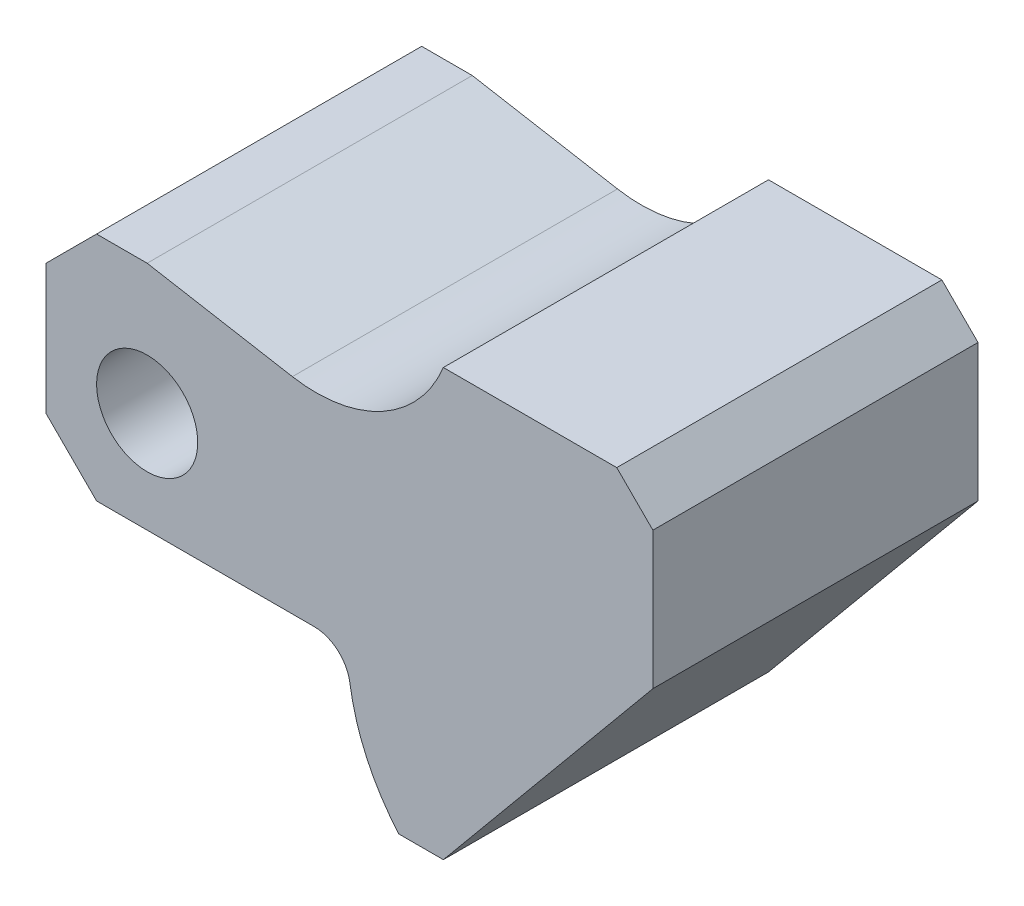
ISO-10303-21;
HEADER;
FILE_DESCRIPTION(('STEP AP214'),'2;1');
FILE_NAME('part.step','',(''),(''),'','','');
FILE_SCHEMA(('AUTOMOTIVE_DESIGN { 1 0 10303 214 1 1 1 1 }'));
ENDSEC;
DATA;
#1=APPLICATION_CONTEXT('core data for automotive mechanical design processes');
#2=APPLICATION_PROTOCOL_DEFINITION('international standard','automotive_design',2000,#1);
#3=PRODUCT_CONTEXT('',#1,'mechanical');
#4=PRODUCT('Part','Part','',(#3));
#5=PRODUCT_RELATED_PRODUCT_CATEGORY('part','',(#4));
#6=PRODUCT_DEFINITION_FORMATION('','',#4);
#7=PRODUCT_DEFINITION_CONTEXT('part definition',#1,'design');
#8=PRODUCT_DEFINITION('design','',#6,#7);
#9=PRODUCT_DEFINITION_SHAPE('','',#8);
#10=(LENGTH_UNIT() NAMED_UNIT(*) SI_UNIT(.MILLI.,.METRE.));
#11=(NAMED_UNIT(*) PLANE_ANGLE_UNIT() SI_UNIT($,.RADIAN.));
#12=(NAMED_UNIT(*) SI_UNIT($,.STERADIAN.) SOLID_ANGLE_UNIT());
#13=UNCERTAINTY_MEASURE_WITH_UNIT(LENGTH_MEASURE(1.E-05),#10,'distance_accuracy_value','');
#14=(GEOMETRIC_REPRESENTATION_CONTEXT(3) GLOBAL_UNCERTAINTY_ASSIGNED_CONTEXT((#13)) GLOBAL_UNIT_ASSIGNED_CONTEXT((#10,
#11,#12)) REPRESENTATION_CONTEXT('',''));
#15=CARTESIAN_POINT('',(0.,0.,0.));
#16=DIRECTION('',(0.,0.,1.));
#17=DIRECTION('',(1.,0.,0.));
#18=AXIS2_PLACEMENT_3D('',#15,#16,#17);
#19=CARTESIAN_POINT('',(56.7428571428571,-14.,45.));
#20=DIRECTION('',(0.,0.,-1.));
#21=DIRECTION('',(-1.,0.,0.));
#22=AXIS2_PLACEMENT_3D('',#19,#20,#21);
#23=PLANE('',#22);
#24=DIRECTION('',(0.,1.,0.));
#25=VECTOR('',#24,1.);
#26=CARTESIAN_POINT('',(70.,26.,45.));
#27=LINE('',#26,#25);
#28=CARTESIAN_POINT('',(70.,2.00000000000001,45.));
#29=VERTEX_POINT('',#28);
#30=CARTESIAN_POINT('',(70.,21.,45.));
#31=VERTEX_POINT('',#30);
#32=EDGE_CURVE('E158',#29,#31,#27,.T.);
#33=ORIENTED_EDGE('',*,*,#32,.T.);
#34=DIRECTION('',(0.707106781186546,-0.707106781186549,0.));
#35=VECTOR('',#34,1.);
#36=CARTESIAN_POINT('',(65.,26.,45.));
#37=LINE('',#36,#35);
#38=CARTESIAN_POINT('',(65.,26.,45.));
#39=VERTEX_POINT('',#38);
#40=EDGE_CURVE('E11',#31,#39,#37,.F.);
#41=ORIENTED_EDGE('',*,*,#40,.T.);
#42=DIRECTION('',(-1.,0.,0.));
#43=VECTOR('',#42,1.);
#44=CARTESIAN_POINT('',(65.,26.,45.));
#45=LINE('',#44,#43);
#46=CARTESIAN_POINT('',(41.,26.,45.));
#47=VERTEX_POINT('',#46);
#48=EDGE_CURVE('E147',#39,#47,#45,.T.);
#49=ORIENTED_EDGE('',*,*,#48,.T.);
#50=CARTESIAN_POINT('',(23.4033577276849,33.1664622192663,45.));
#51=DIRECTION('',(0.,0.,-1.));
#52=DIRECTION('',(1.,0.,0.));
#53=AXIS2_PLACEMENT_3D('',#50,#51,#52);
#54=CIRCLE('',#53,19.);
#55=CARTESIAN_POINT('',(20.1040423520132,14.4551149120344,45.));
#56=VERTEX_POINT('',#55);
#57=EDGE_CURVE('E151',#47,#56,#54,.T.);
#58=ORIENTED_EDGE('',*,*,#57,.T.);
#59=DIRECTION('',(-0.984807753012208,0.173648177666931,0.));
#60=VECTOR('',#59,1.);
#61=CARTESIAN_POINT('',(0.,18.,45.));
#62=LINE('',#61,#60);
#63=CARTESIAN_POINT('',(0.,18.,45.));
#64=VERTEX_POINT('',#63);
#65=EDGE_CURVE('E174',#56,#64,#62,.T.);
#66=ORIENTED_EDGE('',*,*,#65,.T.);
#67=DIRECTION('',(-1.,0.,0.));
#68=VECTOR('',#67,1.);
#69=CARTESIAN_POINT('',(-14.,18.,45.));
#70=LINE('',#69,#68);
#71=CARTESIAN_POINT('',(-6.99999999999998,18.,45.));
#72=VERTEX_POINT('',#71);
#73=EDGE_CURVE('E177',#64,#72,#70,.T.);
#74=ORIENTED_EDGE('',*,*,#73,.T.);
#75=DIRECTION('',(0.707106781186549,0.707106781186546,0.));
#76=VECTOR('',#75,1.);
#77=CARTESIAN_POINT('',(-14.,11.,45.));
#78=LINE('',#77,#76);
#79=CARTESIAN_POINT('',(-14.,11.,45.));
#80=VERTEX_POINT('',#79);
#81=EDGE_CURVE('E280',#72,#80,#78,.F.);
#82=ORIENTED_EDGE('',*,*,#81,.T.);
#83=DIRECTION('',(0.,-1.,0.));
#84=VECTOR('',#83,1.);
#85=CARTESIAN_POINT('',(-14.,-14.,45.));
#86=LINE('',#85,#84);
#87=CARTESIAN_POINT('',(-14.,-6.99999999999998,45.));
#88=VERTEX_POINT('',#87);
#89=EDGE_CURVE('E184',#80,#88,#86,.T.);
#90=ORIENTED_EDGE('',*,*,#89,.T.);
#91=DIRECTION('',(-0.707106781186547,0.707106781186548,0.));
#92=VECTOR('',#91,1.);
#93=CARTESIAN_POINT('',(-7.,-14.,45.));
#94=LINE('',#93,#92);
#95=CARTESIAN_POINT('',(-7.,-14.,45.));
#96=VERTEX_POINT('',#95);
#97=EDGE_CURVE('E283',#88,#96,#94,.F.);
#98=ORIENTED_EDGE('',*,*,#97,.T.);
#99=DIRECTION('',(1.,0.,0.));
#100=VECTOR('',#99,1.);
#101=CARTESIAN_POINT('',(23.1125137012567,-14.,45.));
#102=LINE('',#101,#100);
#103=CARTESIAN_POINT('',(23.1125137012567,-14.,45.));
#104=VERTEX_POINT('',#103);
#105=EDGE_CURVE('E188',#96,#104,#102,.T.);
#106=ORIENTED_EDGE('',*,*,#105,.T.);
#107=CARTESIAN_POINT('',(23.1125137012567,-19.,45.));
#108=DIRECTION('',(0.,0.,-1.));
#109=DIRECTION('',(1.,0.,0.));
#110=AXIS2_PLACEMENT_3D('',#107,#108,#109);
#111=CIRCLE('',#110,5.);
#112=CARTESIAN_POINT('',(28.0581524426685,-18.2647058823529,45.));
#113=VERTEX_POINT('',#112);
#114=EDGE_CURVE('E191',#104,#113,#111,.T.);
#115=ORIENTED_EDGE('',*,*,#114,.T.);
#116=CARTESIAN_POINT('',(56.7428571428571,-14.,45.));
#117=DIRECTION('',(0.,0.,1.));
#118=DIRECTION('',(-1.,0.,0.));
#119=AXIS2_PLACEMENT_3D('',#116,#117,#118);
#120=CIRCLE('',#119,29.);
#121=CARTESIAN_POINT('',(34.8339548426505,-33.,45.));
#122=VERTEX_POINT('',#121);
#123=EDGE_CURVE('E194',#113,#122,#120,.T.);
#124=ORIENTED_EDGE('',*,*,#123,.T.);
#125=DIRECTION('',(1.,0.,0.));
#126=VECTOR('',#125,1.);
#127=CARTESIAN_POINT('',(41.,-33.,45.));
#128=LINE('',#127,#126);
#129=CARTESIAN_POINT('',(41.,-33.,45.));
#130=VERTEX_POINT('',#129);
#131=EDGE_CURVE('E197',#122,#130,#128,.T.);
#132=ORIENTED_EDGE('',*,*,#131,.T.);
#133=DIRECTION('',(0.638017864750323,0.770021560905562,0.));
#134=VECTOR('',#133,1.);
#135=CARTESIAN_POINT('',(70.,2.00000000000001,45.));
#136=LINE('',#135,#134);
#137=EDGE_CURVE('E200',#130,#29,#136,.T.);
#138=ORIENTED_EDGE('',*,*,#137,.T.);
#139=EDGE_LOOP('',(#33,#41,#49,#58,#66,#74,#82,#90,#98,#106,#115,#124,#132,#138));
#140=FACE_BOUND('',#139,.T.);
#141=CARTESIAN_POINT('',(0.,0.,45.));
#142=DIRECTION('',(0.,0.,1.));
#143=DIRECTION('',(1.,0.,0.));
#144=AXIS2_PLACEMENT_3D('',#141,#142,#143);
#145=CIRCLE('',#144,7.);
#146=CARTESIAN_POINT('',(-7.,0.,45.));
#147=VERTEX_POINT('',#146);
#148=EDGE_CURVE('E207',#147,#147,#145,.T.);
#149=ORIENTED_EDGE('',*,*,#148,.F.);
#150=EDGE_LOOP('',(#149));
#151=FACE_BOUND('',#150,.T.);
#152=ADVANCED_FACE('F45',(#140,#151),#23,.F.);
#153=CARTESIAN_POINT('',(56.7428571428571,-14.,0.));
#154=DIRECTION('',(0.,0.,-1.));
#155=DIRECTION('',(-1.,0.,0.));
#156=AXIS2_PLACEMENT_3D('',#153,#154,#155);
#157=PLANE('',#156);
#158=DIRECTION('',(-1.,0.,0.));
#159=VECTOR('',#158,1.);
#160=CARTESIAN_POINT('',(41.,26.,0.));
#161=LINE('',#160,#159);
#162=CARTESIAN_POINT('',(65.,26.,0.));
#163=VERTEX_POINT('',#162);
#164=CARTESIAN_POINT('',(41.,26.,0.));
#165=VERTEX_POINT('',#164);
#166=EDGE_CURVE('E163',#163,#165,#161,.T.);
#167=ORIENTED_EDGE('',*,*,#166,.F.);
#168=DIRECTION('',(-0.707106781186546,0.707106781186549,0.));
#169=VECTOR('',#168,1.);
#170=CARTESIAN_POINT('',(80.8714285714286,10.1285714285713,0.));
#171=LINE('',#170,#169);
#172=CARTESIAN_POINT('',(70.,21.,0.));
#173=VERTEX_POINT('',#172);
#174=EDGE_CURVE('E69',#163,#173,#171,.F.);
#175=ORIENTED_EDGE('',*,*,#174,.T.);
#176=DIRECTION('',(0.,1.,0.));
#177=VECTOR('',#176,1.);
#178=CARTESIAN_POINT('',(70.,26.,0.));
#179=LINE('',#178,#177);
#180=CARTESIAN_POINT('',(70.,2.00000000000001,0.));
#181=VERTEX_POINT('',#180);
#182=EDGE_CURVE('E204',#181,#173,#179,.T.);
#183=ORIENTED_EDGE('',*,*,#182,.F.);
#184=DIRECTION('',(0.638017864750323,0.770021560905562,0.));
#185=VECTOR('',#184,1.);
#186=CARTESIAN_POINT('',(70.,2.00000000000001,0.));
#187=LINE('',#186,#185);
#188=CARTESIAN_POINT('',(41.,-33.,0.));
#189=VERTEX_POINT('',#188);
#190=EDGE_CURVE('E236',#189,#181,#187,.T.);
#191=ORIENTED_EDGE('',*,*,#190,.F.);
#192=DIRECTION('',(1.,0.,0.));
#193=VECTOR('',#192,1.);
#194=CARTESIAN_POINT('',(41.,-33.,0.));
#195=LINE('',#194,#193);
#196=CARTESIAN_POINT('',(34.8339548426505,-33.,0.));
#197=VERTEX_POINT('',#196);
#198=EDGE_CURVE('E233',#197,#189,#195,.T.);
#199=ORIENTED_EDGE('',*,*,#198,.F.);
#200=CARTESIAN_POINT('',(56.7428571428571,-14.,0.));
#201=DIRECTION('',(0.,0.,1.));
#202=DIRECTION('',(-1.,0.,0.));
#203=AXIS2_PLACEMENT_3D('',#200,#201,#202);
#204=CIRCLE('',#203,29.);
#205=CARTESIAN_POINT('',(28.0581524426685,-18.2647058823529,0.));
#206=VERTEX_POINT('',#205);
#207=EDGE_CURVE('E230',#206,#197,#204,.T.);
#208=ORIENTED_EDGE('',*,*,#207,.F.);
#209=CARTESIAN_POINT('',(23.1125137012567,-19.,0.));
#210=DIRECTION('',(0.,0.,-1.));
#211=DIRECTION('',(1.,0.,0.));
#212=AXIS2_PLACEMENT_3D('',#209,#210,#211);
#213=CIRCLE('',#212,5.);
#214=CARTESIAN_POINT('',(23.1125137012567,-14.,0.));
#215=VERTEX_POINT('',#214);
#216=EDGE_CURVE('E227',#215,#206,#213,.T.);
#217=ORIENTED_EDGE('',*,*,#216,.F.);
#218=DIRECTION('',(1.,0.,0.));
#219=VECTOR('',#218,1.);
#220=CARTESIAN_POINT('',(23.1125137012567,-14.,0.));
#221=LINE('',#220,#219);
#222=CARTESIAN_POINT('',(-7.,-14.,0.));
#223=VERTEX_POINT('',#222);
#224=EDGE_CURVE('E224',#223,#215,#221,.T.);
#225=ORIENTED_EDGE('',*,*,#224,.F.);
#226=DIRECTION('',(0.707106781186547,-0.707106781186548,0.));
#227=VECTOR('',#226,1.);
#228=CARTESIAN_POINT('',(24.8714285714285,-45.8714285714286,0.));
#229=LINE('',#228,#227);
#230=CARTESIAN_POINT('',(-14.,-6.99999999999998,0.));
#231=VERTEX_POINT('',#230);
#232=EDGE_CURVE('E270',#223,#231,#229,.F.);
#233=ORIENTED_EDGE('',*,*,#232,.T.);
#234=DIRECTION('',(0.,-1.,0.));
#235=VECTOR('',#234,1.);
#236=CARTESIAN_POINT('',(-14.,-14.,0.));
#237=LINE('',#236,#235);
#238=CARTESIAN_POINT('',(-14.,11.,0.));
#239=VERTEX_POINT('',#238);
#240=EDGE_CURVE('E220',#239,#231,#237,.T.);
#241=ORIENTED_EDGE('',*,*,#240,.F.);
#242=DIRECTION('',(-0.707106781186549,-0.707106781186546,0.));
#243=VECTOR('',#242,1.);
#244=CARTESIAN_POINT('',(8.87142857142871,33.8714285714286,0.));
#245=LINE('',#244,#243);
#246=CARTESIAN_POINT('',(-6.99999999999998,18.,0.));
#247=VERTEX_POINT('',#246);
#248=EDGE_CURVE('E267',#239,#247,#245,.F.);
#249=ORIENTED_EDGE('',*,*,#248,.T.);
#250=DIRECTION('',(-1.,0.,0.));
#251=VECTOR('',#250,1.);
#252=CARTESIAN_POINT('',(-14.,18.,0.));
#253=LINE('',#252,#251);
#254=CARTESIAN_POINT('',(0.,18.,0.));
#255=VERTEX_POINT('',#254);
#256=EDGE_CURVE('E216',#255,#247,#253,.T.);
#257=ORIENTED_EDGE('',*,*,#256,.F.);
#258=DIRECTION('',(-0.984807753012208,0.173648177666931,0.));
#259=VECTOR('',#258,1.);
#260=CARTESIAN_POINT('',(0.,18.,0.));
#261=LINE('',#260,#259);
#262=CARTESIAN_POINT('',(20.1040423520132,14.4551149120344,0.));
#263=VERTEX_POINT('',#262);
#264=EDGE_CURVE('E213',#263,#255,#261,.T.);
#265=ORIENTED_EDGE('',*,*,#264,.F.);
#266=CARTESIAN_POINT('',(23.4033577276849,33.1664622192663,0.));
#267=DIRECTION('',(0.,0.,-1.));
#268=DIRECTION('',(1.,0.,0.));
#269=AXIS2_PLACEMENT_3D('',#266,#267,#268);
#270=CIRCLE('',#269,19.);
#271=EDGE_CURVE('E210',#165,#263,#270,.T.);
#272=ORIENTED_EDGE('',*,*,#271,.F.);
#273=EDGE_LOOP('',(#167,#175,#183,#191,#199,#208,#217,#225,#233,#241,#249,#257,#265,#272));
#274=FACE_BOUND('',#273,.T.);
#275=CARTESIAN_POINT('',(0.,0.,0.));
#276=DIRECTION('',(0.,0.,1.));
#277=DIRECTION('',(1.,0.,0.));
#278=AXIS2_PLACEMENT_3D('',#275,#276,#277);
#279=CIRCLE('',#278,7.);
#280=CARTESIAN_POINT('',(-7.,0.,0.));
#281=VERTEX_POINT('',#280);
#282=EDGE_CURVE('E346',#281,#281,#279,.T.);
#283=ORIENTED_EDGE('',*,*,#282,.T.);
#284=EDGE_LOOP('',(#283));
#285=FACE_BOUND('',#284,.T.);
#286=ADVANCED_FACE('F295',(#274,#285),#157,.T.);
#287=CARTESIAN_POINT('',(70.,26.,45.));
#288=DIRECTION('',(-1.,0.,0.));
#289=DIRECTION('',(0.,-1.,0.));
#290=AXIS2_PLACEMENT_3D('',#287,#288,#289);
#291=PLANE('',#290);
#292=ORIENTED_EDGE('',*,*,#182,.T.);
#293=DIRECTION('',(0.,0.,1.));
#294=VECTOR('',#293,1.);
#295=CARTESIAN_POINT('',(70.,21.,45.));
#296=LINE('',#295,#294);
#297=EDGE_CURVE('E55',#173,#31,#296,.T.);
#298=ORIENTED_EDGE('',*,*,#297,.T.);
#299=ORIENTED_EDGE('',*,*,#32,.F.);
#300=DIRECTION('',(0.,0.,-1.));
#301=VECTOR('',#300,1.);
#302=CARTESIAN_POINT('',(70.,2.00000000000001,45.));
#303=LINE('',#302,#301);
#304=EDGE_CURVE('E203',#29,#181,#303,.T.);
#305=ORIENTED_EDGE('',*,*,#304,.T.);
#306=EDGE_LOOP('',(#292,#298,#299,#305));
#307=FACE_BOUND('',#306,.T.);
#308=ADVANCED_FACE('F343',(#307),#291,.F.);
#309=CARTESIAN_POINT('',(41.,26.,45.));
#310=DIRECTION('',(0.,-1.,0.));
#311=DIRECTION('',(0.,0.,-1.));
#312=AXIS2_PLACEMENT_3D('',#309,#310,#311);
#313=PLANE('',#312);
#314=ORIENTED_EDGE('',*,*,#48,.F.);
#315=DIRECTION('',(0.,0.,-1.));
#316=VECTOR('',#315,1.);
#317=CARTESIAN_POINT('',(65.,26.,45.));
#318=LINE('',#317,#316);
#319=EDGE_CURVE('E289',#39,#163,#318,.T.);
#320=ORIENTED_EDGE('',*,*,#319,.T.);
#321=ORIENTED_EDGE('',*,*,#166,.T.);
#322=DIRECTION('',(0.,0.,-1.));
#323=VECTOR('',#322,1.);
#324=CARTESIAN_POINT('',(41.,26.,45.));
#325=LINE('',#324,#323);
#326=EDGE_CURVE('E161',#47,#165,#325,.T.);
#327=ORIENTED_EDGE('',*,*,#326,.F.);
#328=EDGE_LOOP('',(#314,#320,#321,#327));
#329=FACE_BOUND('',#328,.T.);
#330=ADVANCED_FACE('F162',(#329),#313,.F.);
#331=CARTESIAN_POINT('',(23.4033577276849,33.1664622192663,45.));
#332=DIRECTION('',(0.,0.,-1.));
#333=DIRECTION('',(-1.,0.,0.));
#334=AXIS2_PLACEMENT_3D('',#331,#332,#333);
#335=CYLINDRICAL_SURFACE('',#334,19.);
#336=ORIENTED_EDGE('',*,*,#271,.T.);
#337=DIRECTION('',(0.,0.,-1.));
#338=VECTOR('',#337,1.);
#339=CARTESIAN_POINT('',(20.1040423520132,14.4551149120344,45.));
#340=LINE('',#339,#338);
#341=EDGE_CURVE('E168',#56,#263,#340,.T.);
#342=ORIENTED_EDGE('',*,*,#341,.F.);
#343=ORIENTED_EDGE('',*,*,#57,.F.);
#344=ORIENTED_EDGE('',*,*,#326,.T.);
#345=EDGE_LOOP('',(#336,#342,#343,#344));
#346=FACE_BOUND('',#345,.T.);
#347=ADVANCED_FACE('F170',(#346),#335,.F.);
#348=CARTESIAN_POINT('',(0.,18.,45.));
#349=DIRECTION('',(-0.173648177666931,-0.984807753012208,0.));
#350=DIRECTION('',(0.984807753012208,-0.173648177666931,0.));
#351=AXIS2_PLACEMENT_3D('',#348,#349,#350);
#352=PLANE('',#351);
#353=ORIENTED_EDGE('',*,*,#264,.T.);
#354=DIRECTION('',(0.,0.,-1.));
#355=VECTOR('',#354,1.);
#356=CARTESIAN_POINT('',(0.,18.,45.));
#357=LINE('',#356,#355);
#358=EDGE_CURVE('E258',#64,#255,#357,.T.);
#359=ORIENTED_EDGE('',*,*,#358,.F.);
#360=ORIENTED_EDGE('',*,*,#65,.F.);
#361=ORIENTED_EDGE('',*,*,#341,.T.);
#362=EDGE_LOOP('',(#353,#359,#360,#361));
#363=FACE_BOUND('',#362,.T.);
#364=ADVANCED_FACE('F300',(#363),#352,.F.);
#365=CARTESIAN_POINT('',(-14.,18.,45.));
#366=DIRECTION('',(0.,-1.,0.));
#367=DIRECTION('',(0.,0.,-1.));
#368=AXIS2_PLACEMENT_3D('',#365,#366,#367);
#369=PLANE('',#368);
#370=ORIENTED_EDGE('',*,*,#256,.T.);
#371=DIRECTION('',(0.,0.,1.));
#372=VECTOR('',#371,1.);
#373=CARTESIAN_POINT('',(-6.99999999999998,18.,45.));
#374=LINE('',#373,#372);
#375=EDGE_CURVE('E286',#247,#72,#374,.T.);
#376=ORIENTED_EDGE('',*,*,#375,.T.);
#377=ORIENTED_EDGE('',*,*,#73,.F.);
#378=ORIENTED_EDGE('',*,*,#358,.T.);
#379=EDGE_LOOP('',(#370,#376,#377,#378));
#380=FACE_BOUND('',#379,.T.);
#381=ADVANCED_FACE('F376',(#380),#369,.F.);
#382=CARTESIAN_POINT('',(-14.,-14.,45.));
#383=DIRECTION('',(1.,0.,0.));
#384=DIRECTION('',(0.,1.,0.));
#385=AXIS2_PLACEMENT_3D('',#382,#383,#384);
#386=PLANE('',#385);
#387=ORIENTED_EDGE('',*,*,#240,.T.);
#388=DIRECTION('',(0.,0.,1.));
#389=VECTOR('',#388,1.);
#390=CARTESIAN_POINT('',(-14.,-6.99999999999998,45.));
#391=LINE('',#390,#389);
#392=EDGE_CURVE('E277',#231,#88,#391,.T.);
#393=ORIENTED_EDGE('',*,*,#392,.T.);
#394=ORIENTED_EDGE('',*,*,#89,.F.);
#395=DIRECTION('',(0.,0.,-1.));
#396=VECTOR('',#395,1.);
#397=CARTESIAN_POINT('',(-14.,11.,45.));
#398=LINE('',#397,#396);
#399=EDGE_CURVE('E273',#80,#239,#398,.T.);
#400=ORIENTED_EDGE('',*,*,#399,.T.);
#401=EDGE_LOOP('',(#387,#393,#394,#400));
#402=FACE_BOUND('',#401,.T.);
#403=ADVANCED_FACE('F312',(#402),#386,.F.);
#404=CARTESIAN_POINT('',(23.1125137012567,-14.,45.));
#405=DIRECTION('',(0.,1.,0.));
#406=DIRECTION('',(-1.,0.,0.));
#407=AXIS2_PLACEMENT_3D('',#404,#405,#406);
#408=PLANE('',#407);
#409=ORIENTED_EDGE('',*,*,#105,.F.);
#410=DIRECTION('',(0.,0.,-1.));
#411=VECTOR('',#410,1.);
#412=CARTESIAN_POINT('',(-7.,-14.,45.));
#413=LINE('',#412,#411);
#414=EDGE_CURVE('E167',#96,#223,#413,.T.);
#415=ORIENTED_EDGE('',*,*,#414,.T.);
#416=ORIENTED_EDGE('',*,*,#224,.T.);
#417=DIRECTION('',(0.,0.,-1.));
#418=VECTOR('',#417,1.);
#419=CARTESIAN_POINT('',(23.1125137012567,-14.,45.));
#420=LINE('',#419,#418);
#421=EDGE_CURVE('E254',#104,#215,#420,.T.);
#422=ORIENTED_EDGE('',*,*,#421,.F.);
#423=EDGE_LOOP('',(#409,#415,#416,#422));
#424=FACE_BOUND('',#423,.T.);
#425=ADVANCED_FACE('F322',(#424),#408,.F.);
#426=CARTESIAN_POINT('',(23.1125137012567,-19.,45.));
#427=DIRECTION('',(0.,0.,-1.));
#428=DIRECTION('',(-1.,0.,0.));
#429=AXIS2_PLACEMENT_3D('',#426,#427,#428);
#430=CYLINDRICAL_SURFACE('',#429,5.);
#431=ORIENTED_EDGE('',*,*,#216,.T.);
#432=DIRECTION('',(0.,0.,-1.));
#433=VECTOR('',#432,1.);
#434=CARTESIAN_POINT('',(28.0581524426685,-18.2647058823529,45.));
#435=LINE('',#434,#433);
#436=EDGE_CURVE('E250',#113,#206,#435,.T.);
#437=ORIENTED_EDGE('',*,*,#436,.F.);
#438=ORIENTED_EDGE('',*,*,#114,.F.);
#439=ORIENTED_EDGE('',*,*,#421,.T.);
#440=EDGE_LOOP('',(#431,#437,#438,#439));
#441=FACE_BOUND('',#440,.T.);
#442=ADVANCED_FACE('F329',(#441),#430,.F.);
#443=CARTESIAN_POINT('',(56.7428571428571,-14.,45.));
#444=DIRECTION('',(0.,0.,-1.));
#445=DIRECTION('',(-1.,0.,0.));
#446=AXIS2_PLACEMENT_3D('',#443,#444,#445);
#447=CYLINDRICAL_SURFACE('',#446,29.);
#448=ORIENTED_EDGE('',*,*,#207,.T.);
#449=DIRECTION('',(0.,0.,-1.));
#450=VECTOR('',#449,1.);
#451=CARTESIAN_POINT('',(34.8339548426505,-33.,45.));
#452=LINE('',#451,#450);
#453=EDGE_CURVE('E246',#122,#197,#452,.T.);
#454=ORIENTED_EDGE('',*,*,#453,.F.);
#455=ORIENTED_EDGE('',*,*,#123,.F.);
#456=ORIENTED_EDGE('',*,*,#436,.T.);
#457=EDGE_LOOP('',(#448,#454,#455,#456));
#458=FACE_BOUND('',#457,.T.);
#459=ADVANCED_FACE('F332',(#458),#447,.T.);
#460=CARTESIAN_POINT('',(41.,-33.,45.));
#461=DIRECTION('',(0.,1.,0.));
#462=DIRECTION('',(0.,0.,1.));
#463=AXIS2_PLACEMENT_3D('',#460,#461,#462);
#464=PLANE('',#463);
#465=ORIENTED_EDGE('',*,*,#198,.T.);
#466=DIRECTION('',(0.,0.,-1.));
#467=VECTOR('',#466,1.);
#468=CARTESIAN_POINT('',(41.,-33.,45.));
#469=LINE('',#468,#467);
#470=EDGE_CURVE('E242',#130,#189,#469,.T.);
#471=ORIENTED_EDGE('',*,*,#470,.F.);
#472=ORIENTED_EDGE('',*,*,#131,.F.);
#473=ORIENTED_EDGE('',*,*,#453,.T.);
#474=EDGE_LOOP('',(#465,#471,#472,#473));
#475=FACE_BOUND('',#474,.T.);
#476=ADVANCED_FACE('F337',(#475),#464,.F.);
#477=CARTESIAN_POINT('',(70.,2.00000000000001,45.));
#478=DIRECTION('',(-0.770021560905562,0.638017864750323,0.));
#479=DIRECTION('',(-0.638017864750323,-0.770021560905562,0.));
#480=AXIS2_PLACEMENT_3D('',#477,#478,#479);
#481=PLANE('',#480);
#482=ORIENTED_EDGE('',*,*,#190,.T.);
#483=ORIENTED_EDGE('',*,*,#304,.F.);
#484=ORIENTED_EDGE('',*,*,#137,.F.);
#485=ORIENTED_EDGE('',*,*,#470,.T.);
#486=EDGE_LOOP('',(#482,#483,#484,#485));
#487=FACE_BOUND('',#486,.T.);
#488=ADVANCED_FACE('F341',(#487),#481,.F.);
#489=CARTESIAN_POINT('',(0.,0.,45.));
#490=DIRECTION('',(0.,0.,-1.));
#491=DIRECTION('',(-1.,0.,0.));
#492=AXIS2_PLACEMENT_3D('',#489,#490,#491);
#493=CYLINDRICAL_SURFACE('',#492,7.);
#494=CARTESIAN_POINT('',(-7.,0.,45.));
#495=CARTESIAN_POINT('',(-7.,0.,44.53125));
#496=CARTESIAN_POINT('',(-7.,0.,44.0625));
#497=CARTESIAN_POINT('',(-7.,0.,43.125));
#498=CARTESIAN_POINT('',(-7.,0.,42.65625));
#499=CARTESIAN_POINT('',(-7.,0.,41.71875));
#500=CARTESIAN_POINT('',(-7.,0.,41.25));
#501=CARTESIAN_POINT('',(-7.,0.,40.3125));
#502=CARTESIAN_POINT('',(-7.,0.,39.84375));
#503=CARTESIAN_POINT('',(-7.,0.,38.90625));
#504=CARTESIAN_POINT('',(-7.,0.,38.4375));
#505=CARTESIAN_POINT('',(-7.,0.,37.5));
#506=CARTESIAN_POINT('',(-7.,0.,37.03125));
#507=CARTESIAN_POINT('',(-7.,0.,36.09375));
#508=CARTESIAN_POINT('',(-7.,0.,35.625));
#509=CARTESIAN_POINT('',(-7.,0.,34.6875));
#510=CARTESIAN_POINT('',(-7.,0.,34.21875));
#511=CARTESIAN_POINT('',(-7.,0.,33.28125));
#512=CARTESIAN_POINT('',(-7.,0.,32.8125));
#513=CARTESIAN_POINT('',(-7.,0.,31.875));
#514=CARTESIAN_POINT('',(-7.,0.,31.40625));
#515=CARTESIAN_POINT('',(-7.,0.,30.46875));
#516=CARTESIAN_POINT('',(-7.,0.,30.));
#517=CARTESIAN_POINT('',(-7.,0.,29.0625));
#518=CARTESIAN_POINT('',(-7.,0.,28.59375));
#519=CARTESIAN_POINT('',(-7.,0.,27.65625));
#520=CARTESIAN_POINT('',(-7.,0.,27.1875));
#521=CARTESIAN_POINT('',(-7.,0.,26.25));
#522=CARTESIAN_POINT('',(-7.,0.,25.78125));
#523=CARTESIAN_POINT('',(-7.,0.,24.84375));
#524=CARTESIAN_POINT('',(-7.,0.,24.375));
#525=CARTESIAN_POINT('',(-7.,0.,23.4375));
#526=CARTESIAN_POINT('',(-7.,0.,22.96875));
#527=CARTESIAN_POINT('',(-7.,0.,22.03125));
#528=CARTESIAN_POINT('',(-7.,0.,21.5625));
#529=CARTESIAN_POINT('',(-7.,0.,20.625));
#530=CARTESIAN_POINT('',(-7.,0.,20.15625));
#531=CARTESIAN_POINT('',(-7.,0.,19.21875));
#532=CARTESIAN_POINT('',(-7.,0.,18.75));
#533=CARTESIAN_POINT('',(-7.,0.,17.8125));
#534=CARTESIAN_POINT('',(-7.,0.,17.34375));
#535=CARTESIAN_POINT('',(-7.,0.,16.40625));
#536=CARTESIAN_POINT('',(-7.,0.,15.9375));
#537=CARTESIAN_POINT('',(-7.,0.,15.));
#538=CARTESIAN_POINT('',(-7.,0.,14.53125));
#539=CARTESIAN_POINT('',(-7.,0.,13.59375));
#540=CARTESIAN_POINT('',(-7.,0.,13.125));
#541=CARTESIAN_POINT('',(-7.,0.,12.1875));
#542=CARTESIAN_POINT('',(-7.,0.,11.71875));
#543=CARTESIAN_POINT('',(-7.,0.,10.78125));
#544=CARTESIAN_POINT('',(-7.,0.,10.3125));
#545=CARTESIAN_POINT('',(-7.,0.,9.375));
#546=CARTESIAN_POINT('',(-7.,0.,8.90625));
#547=CARTESIAN_POINT('',(-7.,0.,7.96874999999999));
#548=CARTESIAN_POINT('',(-7.,0.,7.5));
#549=CARTESIAN_POINT('',(-7.,0.,6.5625));
#550=CARTESIAN_POINT('',(-7.,0.,6.09375));
#551=CARTESIAN_POINT('',(-7.,0.,5.15625));
#552=CARTESIAN_POINT('',(-7.,0.,4.68749999999999));
#553=CARTESIAN_POINT('',(-7.,0.,3.74999999999999));
#554=CARTESIAN_POINT('',(-7.,0.,3.28124999999999));
#555=CARTESIAN_POINT('',(-7.,0.,2.34374999999999));
#556=CARTESIAN_POINT('',(-7.,0.,1.87499999999999));
#557=CARTESIAN_POINT('',(-7.,0.,0.937499999999992));
#558=CARTESIAN_POINT('',(-7.,0.,0.468749999999993));
#559=CARTESIAN_POINT('',(-7.,0.,0.));
#560=B_SPLINE_CURVE_WITH_KNOTS('',3,(#494,#495,#496,#497,#498,#499,#500,#501,#502,#503,#504,
#505,#506,#507,#508,#509,#510,#511,#512,#513,#514,#515,#516,#517,#518,#519,#520,#521,#522,#523,
#524,#525,#526,#527,#528,#529,#530,#531,#532,#533,#534,#535,#536,#537,#538,#539,#540,#541,#542,
#543,#544,#545,#546,#547,#548,#549,#550,#551,#552,#553,#554,#555,#556,#557,#558,#559),
.UNSPECIFIED.,.F.,.F.,(4,2,2,2,2,2,2,2,2,2,2,2,2,2,2,2,2,2,2,2,2,2,2,2,2,2,2,2,2,2,2,2,4),(0.,
1.40625,2.8125,4.21875000000001,5.62500000000001,7.03125,8.4375,9.84375000000001,11.25,12.65625,
14.0625,15.46875,16.875,18.28125,19.6875,21.09375,22.5,23.90625,25.3125,26.71875,28.125,
29.53125,30.9375,32.34375,33.75,35.15625,36.5625,37.96875,39.375,40.78125,42.1875,43.59375,45.),.UNSPECIFIED.);
#561=EDGE_CURVE('BSEAM354',#147,#281,#560,.T.);
#562=ORIENTED_EDGE('',*,*,#148,.T.);
#563=ORIENTED_EDGE('',*,*,#282,.F.);
#564=ORIENTED_EDGE('',*,*,#561,.T.);
#565=ORIENTED_EDGE('',*,*,#561,.F.);
#566=EDGE_LOOP('',(#562,#564,#563,#565));
#567=FACE_BOUND('',#566,.T.);
#568=ADVANCED_FACE('F354',(#567),#493,.F.);
#569=CARTESIAN_POINT('',(-7.,-14.,45.));
#570=DIRECTION('',(0.707106781186548,0.707106781186547,0.));
#571=DIRECTION('',(0.,0.,-1.));
#572=AXIS2_PLACEMENT_3D('',#569,#570,#571);
#573=PLANE('',#572);
#574=ORIENTED_EDGE('',*,*,#97,.F.);
#575=ORIENTED_EDGE('',*,*,#392,.F.);
#576=ORIENTED_EDGE('',*,*,#232,.F.);
#577=ORIENTED_EDGE('',*,*,#414,.F.);
#578=EDGE_LOOP('',(#574,#575,#576,#577));
#579=FACE_BOUND('',#578,.T.);
#580=ADVANCED_FACE('F319',(#579),#573,.F.);
#581=CARTESIAN_POINT('',(-14.,11.,45.));
#582=DIRECTION('',(0.707106781186546,-0.707106781186549,0.));
#583=DIRECTION('',(0.,0.,-1.));
#584=AXIS2_PLACEMENT_3D('',#581,#582,#583);
#585=PLANE('',#584);
#586=ORIENTED_EDGE('',*,*,#81,.F.);
#587=ORIENTED_EDGE('',*,*,#375,.F.);
#588=ORIENTED_EDGE('',*,*,#248,.F.);
#589=ORIENTED_EDGE('',*,*,#399,.F.);
#590=EDGE_LOOP('',(#586,#587,#588,#589));
#591=FACE_BOUND('',#590,.T.);
#592=ADVANCED_FACE('F309',(#591),#585,.F.);
#593=CARTESIAN_POINT('',(65.,26.,45.));
#594=DIRECTION('',(-0.707106781186549,-0.707106781186545,0.));
#595=DIRECTION('',(0.,0.,-1.));
#596=AXIS2_PLACEMENT_3D('',#593,#594,#595);
#597=PLANE('',#596);
#598=ORIENTED_EDGE('',*,*,#40,.F.);
#599=ORIENTED_EDGE('',*,*,#297,.F.);
#600=ORIENTED_EDGE('',*,*,#174,.F.);
#601=ORIENTED_EDGE('',*,*,#319,.F.);
#602=EDGE_LOOP('',(#598,#599,#600,#601));
#603=FACE_BOUND('',#602,.T.);
#604=ADVANCED_FACE('F48',(#603),#597,.F.);
#605=CLOSED_SHELL('',(#152,#286,#308,#330,#347,#364,#381,#403,#425,#442,#459,#476,#488,#568,
#580,#592,#604));
#606=MANIFOLD_SOLID_BREP('B2',#605);
#607=ADVANCED_BREP_SHAPE_REPRESENTATION('',(#18,#606),#14);
#608=SHAPE_DEFINITION_REPRESENTATION(#9,#607);
ENDSEC;
END-ISO-10303-21;
